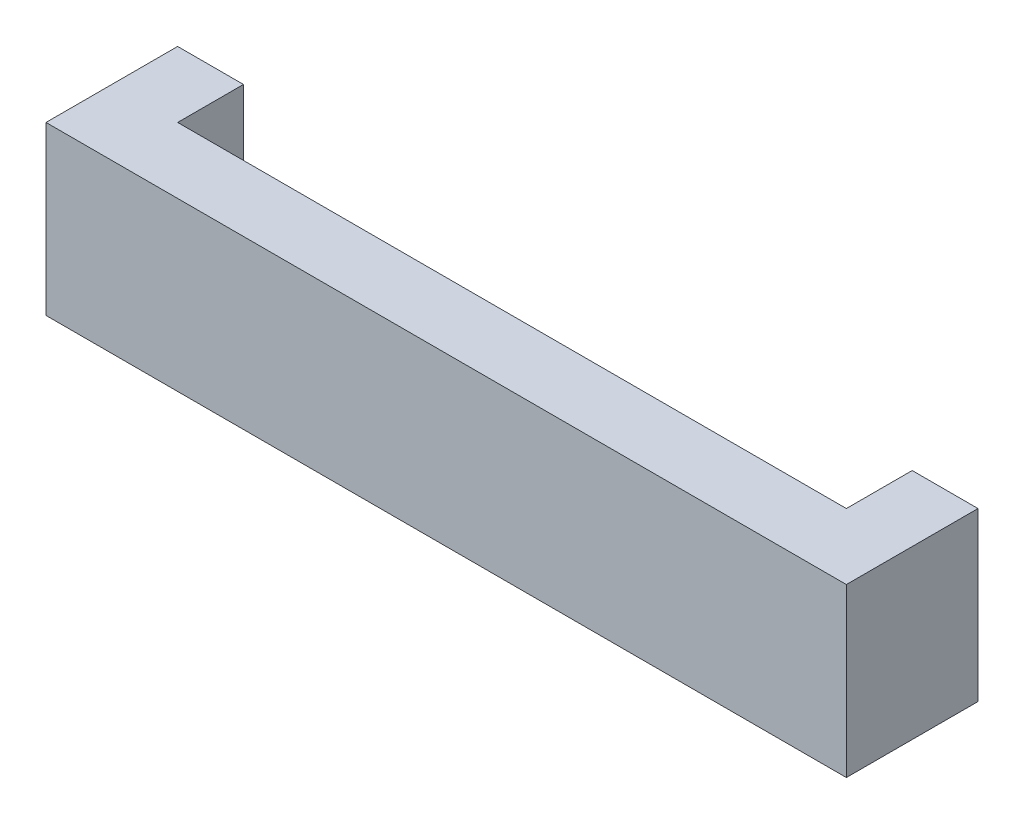
ISO-10303-21;
HEADER;
FILE_DESCRIPTION(('STEP AP214'),'2;1');
FILE_NAME('part.step','',(''),(''),'','','');
FILE_SCHEMA(('AUTOMOTIVE_DESIGN { 1 0 10303 214 1 1 1 1 }'));
ENDSEC;
DATA;
#1=APPLICATION_CONTEXT('core data for automotive mechanical design processes');
#2=APPLICATION_PROTOCOL_DEFINITION('international standard','automotive_design',2000,#1);
#3=PRODUCT_CONTEXT('',#1,'mechanical');
#4=PRODUCT('Part','Part','',(#3));
#5=PRODUCT_RELATED_PRODUCT_CATEGORY('part','',(#4));
#6=PRODUCT_DEFINITION_FORMATION('','',#4);
#7=PRODUCT_DEFINITION_CONTEXT('part definition',#1,'design');
#8=PRODUCT_DEFINITION('design','',#6,#7);
#9=PRODUCT_DEFINITION_SHAPE('','',#8);
#10=(LENGTH_UNIT() NAMED_UNIT(*) SI_UNIT(.MILLI.,.METRE.));
#11=(NAMED_UNIT(*) PLANE_ANGLE_UNIT() SI_UNIT($,.RADIAN.));
#12=(NAMED_UNIT(*) SI_UNIT($,.STERADIAN.) SOLID_ANGLE_UNIT());
#13=UNCERTAINTY_MEASURE_WITH_UNIT(LENGTH_MEASURE(1.E-05),#10,'distance_accuracy_value','');
#14=(GEOMETRIC_REPRESENTATION_CONTEXT(3) GLOBAL_UNCERTAINTY_ASSIGNED_CONTEXT((#13)) GLOBAL_UNIT_ASSIGNED_CONTEXT((#10,
#11,#12)) REPRESENTATION_CONTEXT('',''));
#15=CARTESIAN_POINT('',(0.,0.,0.));
#16=DIRECTION('',(0.,0.,1.));
#17=DIRECTION('',(1.,0.,0.));
#18=AXIS2_PLACEMENT_3D('',#15,#16,#17);
#19=CARTESIAN_POINT('',(-30.4,6.35,5.));
#20=DIRECTION('',(1.,0.,0.));
#21=DIRECTION('',(0.,0.,-1.));
#22=AXIS2_PLACEMENT_3D('',#19,#20,#21);
#23=PLANE('',#22);
#24=DIRECTION('',(0.,0.,1.));
#25=VECTOR('',#24,1.);
#26=CARTESIAN_POINT('',(-30.4,-6.35,5.));
#27=LINE('',#26,#25);
#28=CARTESIAN_POINT('',(-30.4,-6.35,-5.));
#29=VERTEX_POINT('',#28);
#30=CARTESIAN_POINT('',(-30.4,-6.35,5.));
#31=VERTEX_POINT('',#30);
#32=EDGE_CURVE('E129',#29,#31,#27,.T.);
#33=ORIENTED_EDGE('',*,*,#32,.T.);
#34=DIRECTION('',(0.,-1.,0.));
#35=VECTOR('',#34,1.);
#36=CARTESIAN_POINT('',(-30.4,6.35,5.));
#37=LINE('',#36,#35);
#38=CARTESIAN_POINT('',(-30.4,6.35,5.));
#39=VERTEX_POINT('',#38);
#40=EDGE_CURVE('E11',#39,#31,#37,.T.);
#41=ORIENTED_EDGE('',*,*,#40,.F.);
#42=DIRECTION('',(0.,0.,1.));
#43=VECTOR('',#42,1.);
#44=CARTESIAN_POINT('',(-30.4,6.35,5.));
#45=LINE('',#44,#43);
#46=CARTESIAN_POINT('',(-30.4,6.35,-5.));
#47=VERTEX_POINT('',#46);
#48=EDGE_CURVE('E143',#47,#39,#45,.T.);
#49=ORIENTED_EDGE('',*,*,#48,.F.);
#50=DIRECTION('',(0.,-1.,0.));
#51=VECTOR('',#50,1.);
#52=CARTESIAN_POINT('',(-30.4,6.35,-5.));
#53=LINE('',#52,#51);
#54=EDGE_CURVE('E125',#47,#29,#53,.T.);
#55=ORIENTED_EDGE('',*,*,#54,.T.);
#56=EDGE_LOOP('',(#33,#41,#49,#55));
#57=FACE_BOUND('',#56,.T.);
#58=ADVANCED_FACE('F33',(#57),#23,.F.);
#59=CARTESIAN_POINT('',(30.4,6.35,5.));
#60=DIRECTION('',(0.,0.,-1.));
#61=DIRECTION('',(-1.,0.,0.));
#62=AXIS2_PLACEMENT_3D('',#59,#60,#61);
#63=PLANE('',#62);
#64=DIRECTION('',(1.,0.,0.));
#65=VECTOR('',#64,1.);
#66=CARTESIAN_POINT('',(30.4,-6.35,5.));
#67=LINE('',#66,#65);
#68=CARTESIAN_POINT('',(30.4,-6.35,5.));
#69=VERTEX_POINT('',#68);
#70=EDGE_CURVE('E132',#31,#69,#67,.T.);
#71=ORIENTED_EDGE('',*,*,#70,.T.);
#72=DIRECTION('',(0.,-1.,0.));
#73=VECTOR('',#72,1.);
#74=CARTESIAN_POINT('',(30.4,6.35,5.));
#75=LINE('',#74,#73);
#76=CARTESIAN_POINT('',(30.4,6.35,5.));
#77=VERTEX_POINT('',#76);
#78=EDGE_CURVE('E41',#77,#69,#75,.T.);
#79=ORIENTED_EDGE('',*,*,#78,.F.);
#80=DIRECTION('',(1.,0.,0.));
#81=VECTOR('',#80,1.);
#82=CARTESIAN_POINT('',(30.4,6.35,5.));
#83=LINE('',#82,#81);
#84=EDGE_CURVE('E92',#39,#77,#83,.T.);
#85=ORIENTED_EDGE('',*,*,#84,.F.);
#86=ORIENTED_EDGE('',*,*,#40,.T.);
#87=EDGE_LOOP('',(#71,#79,#85,#86));
#88=FACE_BOUND('',#87,.T.);
#89=ADVANCED_FACE('F178',(#88),#63,.F.);
#90=CARTESIAN_POINT('',(30.4,6.35,-5.));
#91=DIRECTION('',(-1.,0.,0.));
#92=DIRECTION('',(0.,0.,1.));
#93=AXIS2_PLACEMENT_3D('',#90,#91,#92);
#94=PLANE('',#93);
#95=DIRECTION('',(0.,0.,-1.));
#96=VECTOR('',#95,1.);
#97=CARTESIAN_POINT('',(30.4,-6.35,-5.));
#98=LINE('',#97,#96);
#99=CARTESIAN_POINT('',(30.4,-6.35,-5.));
#100=VERTEX_POINT('',#99);
#101=EDGE_CURVE('E134',#69,#100,#98,.T.);
#102=ORIENTED_EDGE('',*,*,#101,.T.);
#103=DIRECTION('',(0.,-1.,0.));
#104=VECTOR('',#103,1.);
#105=CARTESIAN_POINT('',(30.4,6.35,-5.));
#106=LINE('',#105,#104);
#107=CARTESIAN_POINT('',(30.4,6.35,-5.));
#108=VERTEX_POINT('',#107);
#109=EDGE_CURVE('E150',#108,#100,#106,.T.);
#110=ORIENTED_EDGE('',*,*,#109,.F.);
#111=DIRECTION('',(0.,0.,-1.));
#112=VECTOR('',#111,1.);
#113=CARTESIAN_POINT('',(30.4,6.35,-5.));
#114=LINE('',#113,#112);
#115=EDGE_CURVE('E158',#77,#108,#114,.T.);
#116=ORIENTED_EDGE('',*,*,#115,.F.);
#117=ORIENTED_EDGE('',*,*,#78,.T.);
#118=EDGE_LOOP('',(#102,#110,#116,#117));
#119=FACE_BOUND('',#118,.T.);
#120=ADVANCED_FACE('F156',(#119),#94,.F.);
#121=CARTESIAN_POINT('',(25.4,6.35,-5.));
#122=DIRECTION('',(0.,0.,1.));
#123=DIRECTION('',(1.,0.,0.));
#124=AXIS2_PLACEMENT_3D('',#121,#122,#123);
#125=PLANE('',#124);
#126=DIRECTION('',(-1.,0.,0.));
#127=VECTOR('',#126,1.);
#128=CARTESIAN_POINT('',(25.4,-6.35,-5.));
#129=LINE('',#128,#127);
#130=CARTESIAN_POINT('',(25.4,-6.35,-5.));
#131=VERTEX_POINT('',#130);
#132=EDGE_CURVE('E136',#100,#131,#129,.T.);
#133=ORIENTED_EDGE('',*,*,#132,.T.);
#134=DIRECTION('',(0.,-1.,0.));
#135=VECTOR('',#134,1.);
#136=CARTESIAN_POINT('',(25.4,6.35,-5.));
#137=LINE('',#136,#135);
#138=CARTESIAN_POINT('',(25.4,6.35,-5.));
#139=VERTEX_POINT('',#138);
#140=EDGE_CURVE('E147',#139,#131,#137,.T.);
#141=ORIENTED_EDGE('',*,*,#140,.F.);
#142=DIRECTION('',(-1.,0.,0.));
#143=VECTOR('',#142,1.);
#144=CARTESIAN_POINT('',(25.4,6.35,-5.));
#145=LINE('',#144,#143);
#146=EDGE_CURVE('E170',#108,#139,#145,.T.);
#147=ORIENTED_EDGE('',*,*,#146,.F.);
#148=ORIENTED_EDGE('',*,*,#109,.T.);
#149=EDGE_LOOP('',(#133,#141,#147,#148));
#150=FACE_BOUND('',#149,.T.);
#151=ADVANCED_FACE('F166',(#150),#125,.F.);
#152=CARTESIAN_POINT('',(25.4,6.35,0.));
#153=DIRECTION('',(1.,0.,0.));
#154=DIRECTION('',(0.,0.,-1.));
#155=AXIS2_PLACEMENT_3D('',#152,#153,#154);
#156=PLANE('',#155);
#157=DIRECTION('',(0.,0.,1.));
#158=VECTOR('',#157,1.);
#159=CARTESIAN_POINT('',(25.4,-6.35,0.));
#160=LINE('',#159,#158);
#161=CARTESIAN_POINT('',(25.4,-6.35,0.));
#162=VERTEX_POINT('',#161);
#163=EDGE_CURVE('E138',#131,#162,#160,.T.);
#164=ORIENTED_EDGE('',*,*,#163,.T.);
#165=DIRECTION('',(0.,-1.,0.));
#166=VECTOR('',#165,1.);
#167=CARTESIAN_POINT('',(25.4,6.35,0.));
#168=LINE('',#167,#166);
#169=CARTESIAN_POINT('',(25.4,6.35,0.));
#170=VERTEX_POINT('',#169);
#171=EDGE_CURVE('E120',#170,#162,#168,.T.);
#172=ORIENTED_EDGE('',*,*,#171,.F.);
#173=DIRECTION('',(0.,0.,1.));
#174=VECTOR('',#173,1.);
#175=CARTESIAN_POINT('',(25.4,6.35,0.));
#176=LINE('',#175,#174);
#177=EDGE_CURVE('E111',#139,#170,#176,.T.);
#178=ORIENTED_EDGE('',*,*,#177,.F.);
#179=ORIENTED_EDGE('',*,*,#140,.T.);
#180=EDGE_LOOP('',(#164,#172,#178,#179));
#181=FACE_BOUND('',#180,.T.);
#182=ADVANCED_FACE('F169',(#181),#156,.F.);
#183=CARTESIAN_POINT('',(-25.4,6.35,0.));
#184=DIRECTION('',(0.,0.,1.));
#185=DIRECTION('',(1.,0.,0.));
#186=AXIS2_PLACEMENT_3D('',#183,#184,#185);
#187=PLANE('',#186);
#188=DIRECTION('',(-1.,0.,0.));
#189=VECTOR('',#188,1.);
#190=CARTESIAN_POINT('',(-25.4,-6.35,0.));
#191=LINE('',#190,#189);
#192=CARTESIAN_POINT('',(-25.4,-6.35,0.));
#193=VERTEX_POINT('',#192);
#194=EDGE_CURVE('E119',#162,#193,#191,.T.);
#195=ORIENTED_EDGE('',*,*,#194,.T.);
#196=DIRECTION('',(0.,-1.,0.));
#197=VECTOR('',#196,1.);
#198=CARTESIAN_POINT('',(-25.4,6.35,0.));
#199=LINE('',#198,#197);
#200=CARTESIAN_POINT('',(-25.4,6.35,0.));
#201=VERTEX_POINT('',#200);
#202=EDGE_CURVE('E116',#201,#193,#199,.T.);
#203=ORIENTED_EDGE('',*,*,#202,.F.);
#204=DIRECTION('',(-1.,0.,0.));
#205=VECTOR('',#204,1.);
#206=CARTESIAN_POINT('',(-25.4,6.35,0.));
#207=LINE('',#206,#205);
#208=EDGE_CURVE('E105',#170,#201,#207,.T.);
#209=ORIENTED_EDGE('',*,*,#208,.F.);
#210=ORIENTED_EDGE('',*,*,#171,.T.);
#211=EDGE_LOOP('',(#195,#203,#209,#210));
#212=FACE_BOUND('',#211,.T.);
#213=ADVANCED_FACE('F117',(#212),#187,.F.);
#214=CARTESIAN_POINT('',(-25.4,6.35,-5.));
#215=DIRECTION('',(-1.,0.,0.));
#216=DIRECTION('',(0.,0.,1.));
#217=AXIS2_PLACEMENT_3D('',#214,#215,#216);
#218=PLANE('',#217);
#219=DIRECTION('',(0.,0.,-1.));
#220=VECTOR('',#219,1.);
#221=CARTESIAN_POINT('',(-25.4,-6.35,-5.));
#222=LINE('',#221,#220);
#223=CARTESIAN_POINT('',(-25.4,-6.35,-5.));
#224=VERTEX_POINT('',#223);
#225=EDGE_CURVE('E78',#193,#224,#222,.T.);
#226=ORIENTED_EDGE('',*,*,#225,.T.);
#227=DIRECTION('',(0.,-1.,0.));
#228=VECTOR('',#227,1.);
#229=CARTESIAN_POINT('',(-25.4,6.35,-5.));
#230=LINE('',#229,#228);
#231=CARTESIAN_POINT('',(-25.4,6.35,-5.));
#232=VERTEX_POINT('',#231);
#233=EDGE_CURVE('E121',#232,#224,#230,.T.);
#234=ORIENTED_EDGE('',*,*,#233,.F.);
#235=DIRECTION('',(0.,0.,-1.));
#236=VECTOR('',#235,1.);
#237=CARTESIAN_POINT('',(-25.4,6.35,-5.));
#238=LINE('',#237,#236);
#239=EDGE_CURVE('E109',#201,#232,#238,.T.);
#240=ORIENTED_EDGE('',*,*,#239,.F.);
#241=ORIENTED_EDGE('',*,*,#202,.T.);
#242=EDGE_LOOP('',(#226,#234,#240,#241));
#243=FACE_BOUND('',#242,.T.);
#244=ADVANCED_FACE('F123',(#243),#218,.F.);
#245=CARTESIAN_POINT('',(-30.4,6.35,-5.));
#246=DIRECTION('',(0.,0.,1.));
#247=DIRECTION('',(1.,0.,0.));
#248=AXIS2_PLACEMENT_3D('',#245,#246,#247);
#249=PLANE('',#248);
#250=DIRECTION('',(-1.,0.,0.));
#251=VECTOR('',#250,1.);
#252=CARTESIAN_POINT('',(-30.4,-6.35,-5.));
#253=LINE('',#252,#251);
#254=EDGE_CURVE('E84',#224,#29,#253,.T.);
#255=ORIENTED_EDGE('',*,*,#254,.T.);
#256=ORIENTED_EDGE('',*,*,#54,.F.);
#257=DIRECTION('',(-1.,0.,0.));
#258=VECTOR('',#257,1.);
#259=CARTESIAN_POINT('',(-30.4,6.35,-5.));
#260=LINE('',#259,#258);
#261=EDGE_CURVE('E49',#232,#47,#260,.T.);
#262=ORIENTED_EDGE('',*,*,#261,.F.);
#263=ORIENTED_EDGE('',*,*,#233,.T.);
#264=EDGE_LOOP('',(#255,#256,#262,#263));
#265=FACE_BOUND('',#264,.T.);
#266=ADVANCED_FACE('F194',(#265),#249,.F.);
#267=CARTESIAN_POINT('',(0.,6.35,0.));
#268=DIRECTION('',(0.,-1.,0.));
#269=DIRECTION('',(0.,0.,-1.));
#270=AXIS2_PLACEMENT_3D('',#267,#268,#269);
#271=PLANE('',#270);
#272=ORIENTED_EDGE('',*,*,#48,.T.);
#273=ORIENTED_EDGE('',*,*,#84,.T.);
#274=ORIENTED_EDGE('',*,*,#115,.T.);
#275=ORIENTED_EDGE('',*,*,#146,.T.);
#276=ORIENTED_EDGE('',*,*,#177,.T.);
#277=ORIENTED_EDGE('',*,*,#208,.T.);
#278=ORIENTED_EDGE('',*,*,#239,.T.);
#279=ORIENTED_EDGE('',*,*,#261,.T.);
#280=EDGE_LOOP('',(#272,#273,#274,#275,#276,#277,#278,#279));
#281=FACE_BOUND('',#280,.T.);
#282=ADVANCED_FACE('F107',(#281),#271,.F.);
#283=CARTESIAN_POINT('',(0.,-6.35,0.));
#284=DIRECTION('',(0.,-1.,0.));
#285=DIRECTION('',(0.,0.,-1.));
#286=AXIS2_PLACEMENT_3D('',#283,#284,#285);
#287=PLANE('',#286);
#288=ORIENTED_EDGE('',*,*,#32,.F.);
#289=ORIENTED_EDGE('',*,*,#254,.F.);
#290=ORIENTED_EDGE('',*,*,#225,.F.);
#291=ORIENTED_EDGE('',*,*,#194,.F.);
#292=ORIENTED_EDGE('',*,*,#163,.F.);
#293=ORIENTED_EDGE('',*,*,#132,.F.);
#294=ORIENTED_EDGE('',*,*,#101,.F.);
#295=ORIENTED_EDGE('',*,*,#70,.F.);
#296=EDGE_LOOP('',(#288,#289,#290,#291,#292,#293,#294,#295));
#297=FACE_BOUND('',#296,.T.);
#298=ADVANCED_FACE('F162',(#297),#287,.T.);
#299=CLOSED_SHELL('',(#58,#89,#120,#151,#182,#213,#244,#266,#282,#298));
#300=MANIFOLD_SOLID_BREP('B2',#299);
#301=ADVANCED_BREP_SHAPE_REPRESENTATION('',(#18,#300),#14);
#302=SHAPE_DEFINITION_REPRESENTATION(#9,#301);
ENDSEC;
END-ISO-10303-21;
